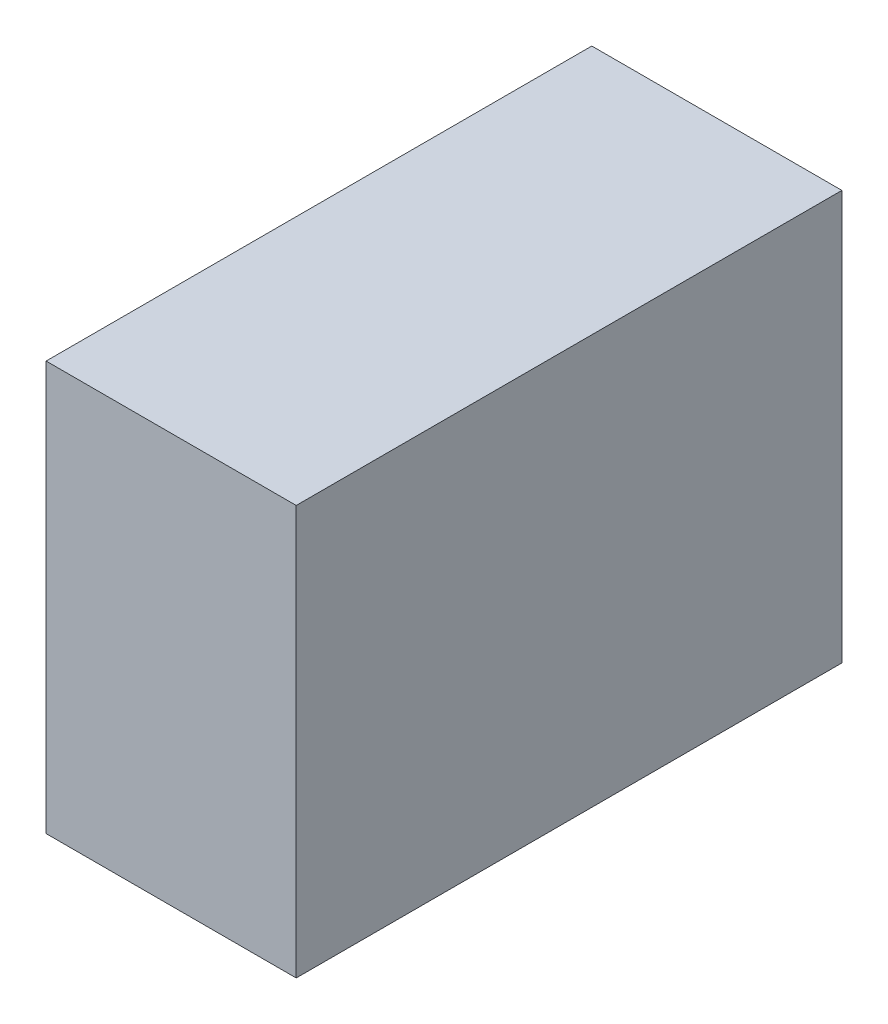
ISO-10303-21;
HEADER;
FILE_DESCRIPTION(('STEP AP214'),'2;1');
FILE_NAME('part.step','',(''),(''),'','','');
FILE_SCHEMA(('AUTOMOTIVE_DESIGN { 1 0 10303 214 1 1 1 1 }'));
ENDSEC;
DATA;
#1=APPLICATION_CONTEXT('core data for automotive mechanical design processes');
#2=APPLICATION_PROTOCOL_DEFINITION('international standard','automotive_design',2000,#1);
#3=PRODUCT_CONTEXT('',#1,'mechanical');
#4=PRODUCT('Part','Part','',(#3));
#5=PRODUCT_RELATED_PRODUCT_CATEGORY('part','',(#4));
#6=PRODUCT_DEFINITION_FORMATION('','',#4);
#7=PRODUCT_DEFINITION_CONTEXT('part definition',#1,'design');
#8=PRODUCT_DEFINITION('design','',#6,#7);
#9=PRODUCT_DEFINITION_SHAPE('','',#8);
#10=(LENGTH_UNIT() NAMED_UNIT(*) SI_UNIT(.MILLI.,.METRE.));
#11=(NAMED_UNIT(*) PLANE_ANGLE_UNIT() SI_UNIT($,.RADIAN.));
#12=(NAMED_UNIT(*) SI_UNIT($,.STERADIAN.) SOLID_ANGLE_UNIT());
#13=UNCERTAINTY_MEASURE_WITH_UNIT(LENGTH_MEASURE(1.E-05),#10,'distance_accuracy_value','');
#14=(GEOMETRIC_REPRESENTATION_CONTEXT(3) GLOBAL_UNCERTAINTY_ASSIGNED_CONTEXT((#13)) GLOBAL_UNIT_ASSIGNED_CONTEXT((#10,
#11,#12)) REPRESENTATION_CONTEXT('',''));
#15=CARTESIAN_POINT('',(0.,0.,0.));
#16=DIRECTION('',(0.,0.,1.));
#17=DIRECTION('',(1.,0.,0.));
#18=AXIS2_PLACEMENT_3D('',#15,#16,#17);
#19=CARTESIAN_POINT('',(32.2462,93.726,12.));
#20=DIRECTION('',(-1.,0.,0.));
#21=DIRECTION('',(0.,0.,1.));
#22=AXIS2_PLACEMENT_3D('',#19,#20,#21);
#23=PLANE('',#22);
#24=DIRECTION('',(0.,1.,0.));
#25=VECTOR('',#24,1.);
#26=CARTESIAN_POINT('',(32.2462,93.726,0.));
#27=LINE('',#26,#25);
#28=CARTESIAN_POINT('',(32.2462,84.726,0.));
#29=VERTEX_POINT('',#28);
#30=CARTESIAN_POINT('',(32.2462,93.726,0.));
#31=VERTEX_POINT('',#30);
#32=EDGE_CURVE('E96',#29,#31,#27,.T.);
#33=ORIENTED_EDGE('',*,*,#32,.T.);
#34=DIRECTION('',(0.,0.,-1.));
#35=VECTOR('',#34,1.);
#36=CARTESIAN_POINT('',(32.2462,93.726,12.));
#37=LINE('',#36,#35);
#38=CARTESIAN_POINT('',(32.2462,93.726,12.));
#39=VERTEX_POINT('',#38);
#40=EDGE_CURVE('E11',#39,#31,#37,.T.);
#41=ORIENTED_EDGE('',*,*,#40,.F.);
#42=DIRECTION('',(0.,1.,0.));
#43=VECTOR('',#42,1.);
#44=CARTESIAN_POINT('',(32.2462,93.726,12.));
#45=LINE('',#44,#43);
#46=CARTESIAN_POINT('',(32.2462,84.726,12.));
#47=VERTEX_POINT('',#46);
#48=EDGE_CURVE('E84',#47,#39,#45,.T.);
#49=ORIENTED_EDGE('',*,*,#48,.F.);
#50=DIRECTION('',(0.,0.,-1.));
#51=VECTOR('',#50,1.);
#52=CARTESIAN_POINT('',(32.2462,84.726,12.));
#53=LINE('',#52,#51);
#54=EDGE_CURVE('E92',#47,#29,#53,.T.);
#55=ORIENTED_EDGE('',*,*,#54,.T.);
#56=EDGE_LOOP('',(#33,#41,#49,#55));
#57=FACE_BOUND('',#56,.T.);
#58=ADVANCED_FACE('F33',(#57),#23,.F.);
#59=CARTESIAN_POINT('',(32.2462,93.726,12.));
#60=DIRECTION('',(0.,-1.,0.));
#61=DIRECTION('',(0.,0.,-1.));
#62=AXIS2_PLACEMENT_3D('',#59,#60,#61);
#63=PLANE('',#62);
#64=DIRECTION('',(-1.,0.,0.));
#65=VECTOR('',#64,1.);
#66=CARTESIAN_POINT('',(32.2462,93.726,0.));
#67=LINE('',#66,#65);
#68=CARTESIAN_POINT('',(26.7462,93.726,0.));
#69=VERTEX_POINT('',#68);
#70=EDGE_CURVE('E88',#31,#69,#67,.T.);
#71=ORIENTED_EDGE('',*,*,#70,.T.);
#72=DIRECTION('',(0.,0.,-1.));
#73=VECTOR('',#72,1.);
#74=CARTESIAN_POINT('',(26.7462,93.726,12.));
#75=LINE('',#74,#73);
#76=CARTESIAN_POINT('',(26.7462,93.726,12.));
#77=VERTEX_POINT('',#76);
#78=EDGE_CURVE('E41',#77,#69,#75,.T.);
#79=ORIENTED_EDGE('',*,*,#78,.F.);
#80=DIRECTION('',(-1.,0.,0.));
#81=VECTOR('',#80,1.);
#82=CARTESIAN_POINT('',(32.2462,93.726,12.));
#83=LINE('',#82,#81);
#84=EDGE_CURVE('E79',#39,#77,#83,.T.);
#85=ORIENTED_EDGE('',*,*,#84,.F.);
#86=ORIENTED_EDGE('',*,*,#40,.T.);
#87=EDGE_LOOP('',(#71,#79,#85,#86));
#88=FACE_BOUND('',#87,.T.);
#89=ADVANCED_FACE('F87',(#88),#63,.F.);
#90=CARTESIAN_POINT('',(26.7462,93.726,12.));
#91=DIRECTION('',(1.,0.,0.));
#92=DIRECTION('',(0.,0.,-1.));
#93=AXIS2_PLACEMENT_3D('',#90,#91,#92);
#94=PLANE('',#93);
#95=DIRECTION('',(0.,-1.,0.));
#96=VECTOR('',#95,1.);
#97=CARTESIAN_POINT('',(26.7462,93.726,0.));
#98=LINE('',#97,#96);
#99=CARTESIAN_POINT('',(26.7462,84.726,0.));
#100=VERTEX_POINT('',#99);
#101=EDGE_CURVE('E66',#69,#100,#98,.T.);
#102=ORIENTED_EDGE('',*,*,#101,.T.);
#103=DIRECTION('',(0.,0.,-1.));
#104=VECTOR('',#103,1.);
#105=CARTESIAN_POINT('',(26.7462,84.726,12.));
#106=LINE('',#105,#104);
#107=CARTESIAN_POINT('',(26.7462,84.726,12.));
#108=VERTEX_POINT('',#107);
#109=EDGE_CURVE('E89',#108,#100,#106,.T.);
#110=ORIENTED_EDGE('',*,*,#109,.F.);
#111=DIRECTION('',(0.,-1.,0.));
#112=VECTOR('',#111,1.);
#113=CARTESIAN_POINT('',(26.7462,93.726,12.));
#114=LINE('',#113,#112);
#115=EDGE_CURVE('E82',#77,#108,#114,.T.);
#116=ORIENTED_EDGE('',*,*,#115,.F.);
#117=ORIENTED_EDGE('',*,*,#78,.T.);
#118=EDGE_LOOP('',(#102,#110,#116,#117));
#119=FACE_BOUND('',#118,.T.);
#120=ADVANCED_FACE('F90',(#119),#94,.F.);
#121=CARTESIAN_POINT('',(32.2462,84.726,12.));
#122=DIRECTION('',(0.,1.,0.));
#123=DIRECTION('',(0.,0.,1.));
#124=AXIS2_PLACEMENT_3D('',#121,#122,#123);
#125=PLANE('',#124);
#126=DIRECTION('',(1.,0.,0.));
#127=VECTOR('',#126,1.);
#128=CARTESIAN_POINT('',(32.2462,84.726,0.));
#129=LINE('',#128,#127);
#130=EDGE_CURVE('E72',#100,#29,#129,.T.);
#131=ORIENTED_EDGE('',*,*,#130,.T.);
#132=ORIENTED_EDGE('',*,*,#54,.F.);
#133=DIRECTION('',(1.,0.,0.));
#134=VECTOR('',#133,1.);
#135=CARTESIAN_POINT('',(32.2462,84.726,12.));
#136=LINE('',#135,#134);
#137=EDGE_CURVE('E49',#108,#47,#136,.T.);
#138=ORIENTED_EDGE('',*,*,#137,.F.);
#139=ORIENTED_EDGE('',*,*,#109,.T.);
#140=EDGE_LOOP('',(#131,#132,#138,#139));
#141=FACE_BOUND('',#140,.T.);
#142=ADVANCED_FACE('F103',(#141),#125,.F.);
#143=CARTESIAN_POINT('',(0.,0.,12.));
#144=DIRECTION('',(0.,0.,-1.));
#145=DIRECTION('',(-1.,0.,0.));
#146=AXIS2_PLACEMENT_3D('',#143,#144,#145);
#147=PLANE('',#146);
#148=ORIENTED_EDGE('',*,*,#48,.T.);
#149=ORIENTED_EDGE('',*,*,#84,.T.);
#150=ORIENTED_EDGE('',*,*,#115,.T.);
#151=ORIENTED_EDGE('',*,*,#137,.T.);
#152=EDGE_LOOP('',(#148,#149,#150,#151));
#153=FACE_BOUND('',#152,.T.);
#154=ADVANCED_FACE('F80',(#153),#147,.F.);
#155=CARTESIAN_POINT('',(0.,0.,0.));
#156=DIRECTION('',(0.,0.,-1.));
#157=DIRECTION('',(-1.,0.,0.));
#158=AXIS2_PLACEMENT_3D('',#155,#156,#157);
#159=PLANE('',#158);
#160=ORIENTED_EDGE('',*,*,#32,.F.);
#161=ORIENTED_EDGE('',*,*,#130,.F.);
#162=ORIENTED_EDGE('',*,*,#101,.F.);
#163=ORIENTED_EDGE('',*,*,#70,.F.);
#164=EDGE_LOOP('',(#160,#161,#162,#163));
#165=FACE_BOUND('',#164,.T.);
#166=ADVANCED_FACE('F106',(#165),#159,.T.);
#167=CLOSED_SHELL('',(#58,#89,#120,#142,#154,#166));
#168=MANIFOLD_SOLID_BREP('B2',#167);
#169=ADVANCED_BREP_SHAPE_REPRESENTATION('',(#18,#168),#14);
#170=SHAPE_DEFINITION_REPRESENTATION(#9,#169);
ENDSEC;
END-ISO-10303-21;
